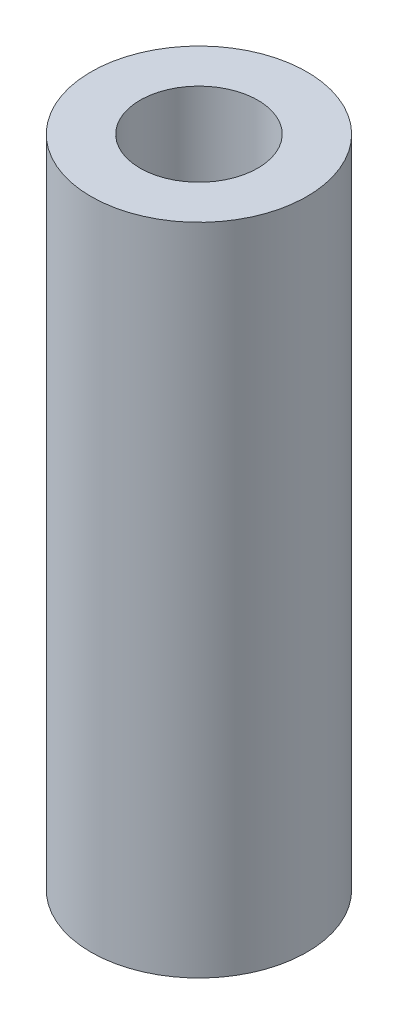
ISO-10303-21;
HEADER;
FILE_DESCRIPTION(('STEP AP214'),'2;1');
FILE_NAME('part.step','',(''),(''),'','','');
FILE_SCHEMA(('AUTOMOTIVE_DESIGN { 1 0 10303 214 1 1 1 1 }'));
ENDSEC;
DATA;
#1=APPLICATION_CONTEXT('core data for automotive mechanical design processes');
#2=APPLICATION_PROTOCOL_DEFINITION('international standard','automotive_design',2000,#1);
#3=PRODUCT_CONTEXT('',#1,'mechanical');
#4=PRODUCT('Part','Part','',(#3));
#5=PRODUCT_RELATED_PRODUCT_CATEGORY('part','',(#4));
#6=PRODUCT_DEFINITION_FORMATION('','',#4);
#7=PRODUCT_DEFINITION_CONTEXT('part definition',#1,'design');
#8=PRODUCT_DEFINITION('design','',#6,#7);
#9=PRODUCT_DEFINITION_SHAPE('','',#8);
#10=(LENGTH_UNIT() NAMED_UNIT(*) SI_UNIT(.MILLI.,.METRE.));
#11=(NAMED_UNIT(*) PLANE_ANGLE_UNIT() SI_UNIT($,.RADIAN.));
#12=(NAMED_UNIT(*) SI_UNIT($,.STERADIAN.) SOLID_ANGLE_UNIT());
#13=UNCERTAINTY_MEASURE_WITH_UNIT(LENGTH_MEASURE(1.E-05),#10,'distance_accuracy_value','');
#14=(GEOMETRIC_REPRESENTATION_CONTEXT(3) GLOBAL_UNCERTAINTY_ASSIGNED_CONTEXT((#13)) GLOBAL_UNIT_ASSIGNED_CONTEXT((#10,
#11,#12)) REPRESENTATION_CONTEXT('',''));
#15=CARTESIAN_POINT('',(0.,0.,0.));
#16=DIRECTION('',(0.,0.,1.));
#17=DIRECTION('',(1.,0.,0.));
#18=AXIS2_PLACEMENT_3D('',#15,#16,#17);
#19=CARTESIAN_POINT('',(0.,20.,0.));
#20=DIRECTION('',(0.,1.,0.));
#21=DIRECTION('',(0.,0.,1.));
#22=AXIS2_PLACEMENT_3D('',#19,#20,#21);
#23=PLANE('',#22);
#24=CARTESIAN_POINT('',(0.,20.,0.));
#25=DIRECTION('',(0.,1.,0.));
#26=DIRECTION('',(0.,0.,1.));
#27=AXIS2_PLACEMENT_3D('',#24,#25,#26);
#28=CIRCLE('',#27,3.3);
#29=CARTESIAN_POINT('',(0.,20.,3.3));
#30=VERTEX_POINT('',#29);
#31=EDGE_CURVE('E10',#30,#30,#28,.T.);
#32=ORIENTED_EDGE('',*,*,#31,.T.);
#33=EDGE_LOOP('',(#32));
#34=FACE_BOUND('',#33,.T.);
#35=CARTESIAN_POINT('',(0.,20.,0.));
#36=DIRECTION('',(0.,1.,0.));
#37=DIRECTION('',(0.,0.,1.));
#38=AXIS2_PLACEMENT_3D('',#35,#36,#37);
#39=CIRCLE('',#38,1.8);
#40=CARTESIAN_POINT('',(0.,20.,1.8));
#41=VERTEX_POINT('',#40);
#42=EDGE_CURVE('E44',#41,#41,#39,.T.);
#43=ORIENTED_EDGE('',*,*,#42,.F.);
#44=EDGE_LOOP('',(#43));
#45=FACE_BOUND('',#44,.T.);
#46=ADVANCED_FACE('F33',(#34,#45),#23,.T.);
#47=CARTESIAN_POINT('',(0.,0.,0.));
#48=DIRECTION('',(0.,1.,0.));
#49=DIRECTION('',(0.,0.,1.));
#50=AXIS2_PLACEMENT_3D('',#47,#48,#49);
#51=PLANE('',#50);
#52=CARTESIAN_POINT('',(0.,0.,0.));
#53=DIRECTION('',(0.,1.,0.));
#54=DIRECTION('',(0.,0.,1.));
#55=AXIS2_PLACEMENT_3D('',#52,#53,#54);
#56=CIRCLE('',#55,3.3);
#57=CARTESIAN_POINT('',(0.,0.,3.3));
#58=VERTEX_POINT('',#57);
#59=EDGE_CURVE('E37',#58,#58,#56,.T.);
#60=ORIENTED_EDGE('',*,*,#59,.F.);
#61=EDGE_LOOP('',(#60));
#62=FACE_BOUND('',#61,.T.);
#63=CARTESIAN_POINT('',(0.,0.,0.));
#64=DIRECTION('',(0.,1.,0.));
#65=DIRECTION('',(0.,0.,1.));
#66=AXIS2_PLACEMENT_3D('',#63,#64,#65);
#67=CIRCLE('',#66,1.8);
#68=CARTESIAN_POINT('',(0.,0.,1.8));
#69=VERTEX_POINT('',#68);
#70=EDGE_CURVE('E46',#69,#69,#67,.T.);
#71=ORIENTED_EDGE('',*,*,#70,.T.);
#72=EDGE_LOOP('',(#71));
#73=FACE_BOUND('',#72,.T.);
#74=ADVANCED_FACE('F56',(#62,#73),#51,.F.);
#75=CARTESIAN_POINT('',(0.,20.,0.));
#76=DIRECTION('',(0.,-1.,0.));
#77=DIRECTION('',(0.,0.,-1.));
#78=AXIS2_PLACEMENT_3D('',#75,#76,#77);
#79=CYLINDRICAL_SURFACE('',#78,3.3);
#80=ORIENTED_EDGE('',*,*,#31,.F.);
#81=EDGE_LOOP('',(#80));
#82=FACE_BOUND('',#81,.T.);
#83=ORIENTED_EDGE('',*,*,#59,.T.);
#84=EDGE_LOOP('',(#83));
#85=FACE_BOUND('',#84,.T.);
#86=ADVANCED_FACE('F35',(#82,#85),#79,.T.);
#87=CARTESIAN_POINT('',(0.,20.,0.));
#88=DIRECTION('',(0.,-1.,0.));
#89=DIRECTION('',(0.,0.,-1.));
#90=AXIS2_PLACEMENT_3D('',#87,#88,#89);
#91=CYLINDRICAL_SURFACE('',#90,1.8);
#92=ORIENTED_EDGE('',*,*,#42,.T.);
#93=EDGE_LOOP('',(#92));
#94=FACE_BOUND('',#93,.T.);
#95=ORIENTED_EDGE('',*,*,#70,.F.);
#96=EDGE_LOOP('',(#95));
#97=FACE_BOUND('',#96,.T.);
#98=ADVANCED_FACE('F52',(#94,#97),#91,.F.);
#99=CLOSED_SHELL('',(#46,#74,#86,#98));
#100=MANIFOLD_SOLID_BREP('B2',#99);
#101=ADVANCED_BREP_SHAPE_REPRESENTATION('',(#18,#100),#14);
#102=SHAPE_DEFINITION_REPRESENTATION(#9,#101);
ENDSEC;
END-ISO-10303-21;
